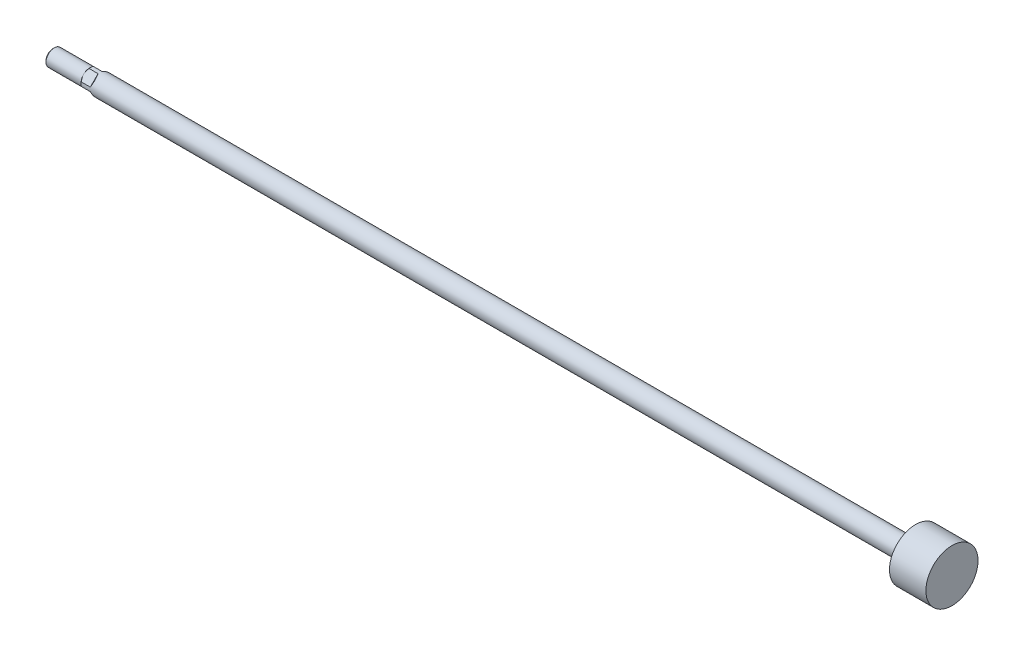
ISO-10303-21;
HEADER;
FILE_DESCRIPTION(('STEP AP214'),'2;1');
FILE_NAME('part.step','',(''),(''),'','','');
FILE_SCHEMA(('AUTOMOTIVE_DESIGN { 1 0 10303 214 1 1 1 1 }'));
ENDSEC;
DATA;
#1=APPLICATION_CONTEXT('core data for automotive mechanical design processes');
#2=APPLICATION_PROTOCOL_DEFINITION('international standard','automotive_design',2000,#1);
#3=PRODUCT_CONTEXT('',#1,'mechanical');
#4=PRODUCT('Part','Part','',(#3));
#5=PRODUCT_RELATED_PRODUCT_CATEGORY('part','',(#4));
#6=PRODUCT_DEFINITION_FORMATION('','',#4);
#7=PRODUCT_DEFINITION_CONTEXT('part definition',#1,'design');
#8=PRODUCT_DEFINITION('design','',#6,#7);
#9=PRODUCT_DEFINITION_SHAPE('','',#8);
#10=(LENGTH_UNIT() NAMED_UNIT(*) SI_UNIT(.MILLI.,.METRE.));
#11=(NAMED_UNIT(*) PLANE_ANGLE_UNIT() SI_UNIT($,.RADIAN.));
#12=(NAMED_UNIT(*) SI_UNIT($,.STERADIAN.) SOLID_ANGLE_UNIT());
#13=UNCERTAINTY_MEASURE_WITH_UNIT(LENGTH_MEASURE(1.E-05),#10,'distance_accuracy_value','');
#14=(GEOMETRIC_REPRESENTATION_CONTEXT(3) GLOBAL_UNCERTAINTY_ASSIGNED_CONTEXT((#13)) GLOBAL_UNIT_ASSIGNED_CONTEXT((#10,
#11,#12)) REPRESENTATION_CONTEXT('',''));
#15=CARTESIAN_POINT('',(0.,0.,0.));
#16=DIRECTION('',(0.,0.,1.));
#17=DIRECTION('',(1.,0.,0.));
#18=AXIS2_PLACEMENT_3D('',#15,#16,#17);
#19=CARTESIAN_POINT('',(23.,0.,0.));
#20=DIRECTION('',(1.,0.,0.));
#21=DIRECTION('',(0.,0.,-1.));
#22=AXIS2_PLACEMENT_3D('',#19,#20,#21);
#23=CONICAL_SURFACE('',#22,5.99999999999999,0.785398163397445);
#24=CARTESIAN_POINT('',(23.,0.,0.));
#25=DIRECTION('',(-1.,0.,0.));
#26=DIRECTION('',(0.,0.,1.));
#27=AXIS2_PLACEMENT_3D('',#24,#25,#26);
#28=CIRCLE('',#27,5.99999999999999);
#29=CARTESIAN_POINT('',(23.,-5.88074178584445,-1.19032602602103));
#30=VERTEX_POINT('',#29);
#31=CARTESIAN_POINT('',(23.,-5.88074178584444,1.19032602602103));
#32=VERTEX_POINT('',#31);
#33=EDGE_CURVE('E207',#30,#32,#28,.T.);
#34=ORIENTED_EDGE('',*,*,#33,.T.);
#35=CARTESIAN_POINT('',(23.0002,-5.88099761701418,1.19007019485129));
#36=CARTESIAN_POINT('',(22.9510440724068,-5.81811483877079,1.25295297309469));
#37=CARTESIAN_POINT('',(22.9029313524006,-5.75482507418754,1.31624273767794));
#38=CARTESIAN_POINT('',(22.8090823894487,-5.62734850641512,1.44371930545035));
#39=CARTESIAN_POINT('',(22.7633468355185,-5.56316144991378,1.5079063619517));
#40=CARTESIAN_POINT('',(22.6298425181199,-5.36868839423572,1.70237941762975));
#41=CARTESIAN_POINT('',(22.5461580251507,-5.23697199461113,1.83409581725435));
#42=CARTESIAN_POINT('',(22.3921031533509,-4.96822727016499,2.10284054170049));
#43=CARTESIAN_POINT('',(22.3218635701848,-4.83116098734405,2.23990682452143));
#44=CARTESIAN_POINT('',(22.1996463430325,-4.55314819356125,2.51791961830423));
#45=CARTESIAN_POINT('',(22.1476398226633,-4.41220820286018,2.6588596090053));
#46=CARTESIAN_POINT('',(22.076734746217,-4.16562053549287,2.9054472763726));
#47=CARTESIAN_POINT('',(22.0526890191447,-4.06071275132046,3.01035506054501));
#48=CARTESIAN_POINT('',(22.0175298585743,-3.84979184907856,3.22127596278691));
#49=CARTESIAN_POINT('',(22.0064169654416,-3.7437786850103,3.32728912685517));
#50=CARTESIAN_POINT('',(21.9977783521526,-3.53213647013354,3.53893134173194));
#51=CARTESIAN_POINT('',(22.0001680259723,-3.42650916818231,3.64455864368317));
#52=CARTESIAN_POINT('',(22.0181960610271,-3.21582855252734,3.85523925933814));
#53=CARTESIAN_POINT('',(22.0338352417217,-3.1107752747305,3.96029253713497));
#54=CARTESIAN_POINT('',(22.0830231598923,-2.87582236565578,4.19524544620969));
#55=CARTESIAN_POINT('',(22.1200764012196,-2.74628952530572,4.32477828655975));
#56=CARTESIAN_POINT('',(22.2110065453868,-2.49021090718481,4.58085690468066));
#57=CARTESIAN_POINT('',(22.2648923193015,-2.36366674241764,4.70740106944784));
#58=CARTESIAN_POINT('',(22.386785732996,-2.11334572452889,4.95772208733659));
#59=CARTESIAN_POINT('',(22.4548649705229,-1.989586569211,5.08148124265448));
#60=CARTESIAN_POINT('',(22.6021483972448,-1.74549978196564,5.32556802989984));
#61=CARTESIAN_POINT('',(22.6813495208955,-1.62517121541694,5.44589659644854));
#62=CARTESIAN_POINT('',(22.8025857634105,-1.45295236100189,5.61811545086358));
#63=CARTESIAN_POINT('',(22.8411147424624,-1.39980646766215,5.67126134420333));
#64=CARTESIAN_POINT('',(22.9195954983845,-1.29437286498691,5.77669494687857));
#65=CARTESIAN_POINT('',(22.9595394195067,-1.24208223430455,5.82898557756093));
#66=CARTESIAN_POINT('',(23.0002,-1.19007019485129,5.88099761701419));
#67=B_SPLINE_CURVE_WITH_KNOTS('',3,(#35,#36,#37,#38,#39,#40,#41,#42,#43,#44,#45,#46,#47,#48,#49,
#50,#51,#52,#53,#54,#55,#56,#57,#58,#59,#60,#61,#62,#63,#64,#65,#66),.UNSPECIFIED.,.F.,.F.,(4,2,
2,2,2,2,2,2,2,2,2,2,2,2,2,4),(0.,0.304819578685165,0.609727021411994,1.22188083188482,
1.83971682595719,2.45656986235395,2.90695888785131,3.35736673103194,3.80495549641761,
4.2525719464311,4.81229509723279,5.37231373221707,5.93522881986322,6.49798905371364,
6.75135396448927,7.00348316582242),.UNSPECIFIED.);
#68=CARTESIAN_POINT('',(22.,-3.53553390593274,3.53553390593274));
#69=VERTEX_POINT('',#68);
#70=EDGE_CURVE('E245',#32,#69,#67,.T.);
#71=ORIENTED_EDGE('',*,*,#70,.T.);
#72=CARTESIAN_POINT('',(22.,0.,0.));
#73=DIRECTION('',(-1.,0.,0.));
#74=DIRECTION('',(0.,0.,1.));
#75=AXIS2_PLACEMENT_3D('',#72,#73,#74);
#76=CIRCLE('',#75,5.);
#77=CARTESIAN_POINT('',(22.,-3.53553390593274,-3.53553390593274));
#78=VERTEX_POINT('',#77);
#79=EDGE_CURVE('E216',#78,#69,#76,.T.);
#80=ORIENTED_EDGE('',*,*,#79,.F.);
#81=CARTESIAN_POINT('',(23.0002,-1.19007019485129,-5.88099761701418));
#82=CARTESIAN_POINT('',(22.9510440724068,-1.25295297309469,-5.81811483877079));
#83=CARTESIAN_POINT('',(22.9029313524006,-1.31624273767794,-5.75482507418754));
#84=CARTESIAN_POINT('',(22.8090823894487,-1.44371930545035,-5.62734850641512));
#85=CARTESIAN_POINT('',(22.7633468355185,-1.50790636195169,-5.56316144991378));
#86=CARTESIAN_POINT('',(22.6298425181199,-1.70237941762975,-5.36868839423572));
#87=CARTESIAN_POINT('',(22.5461580251507,-1.83409581725435,-5.23697199461113));
#88=CARTESIAN_POINT('',(22.3921031533509,-2.10284054170049,-4.96822727016499));
#89=CARTESIAN_POINT('',(22.3218635701848,-2.23990682452143,-4.83116098734405));
#90=CARTESIAN_POINT('',(22.1996463430325,-2.51791961830422,-4.55314819356125));
#91=CARTESIAN_POINT('',(22.1476398226633,-2.6588596090053,-4.41220820286018));
#92=CARTESIAN_POINT('',(22.076734746217,-2.9054472763726,-4.16562053549287));
#93=CARTESIAN_POINT('',(22.0526890191447,-3.01035506054501,-4.06071275132046));
#94=CARTESIAN_POINT('',(22.0175298585743,-3.22127596278691,-3.84979184907856));
#95=CARTESIAN_POINT('',(22.0064169654416,-3.32728912685517,-3.7437786850103));
#96=CARTESIAN_POINT('',(21.9977783521526,-3.53893134173194,-3.53213647013354));
#97=CARTESIAN_POINT('',(22.0001680259723,-3.64455864368317,-3.42650916818231));
#98=CARTESIAN_POINT('',(22.0181960610271,-3.85523925933814,-3.21582855252734));
#99=CARTESIAN_POINT('',(22.0338352417217,-3.96029253713497,-3.1107752747305));
#100=CARTESIAN_POINT('',(22.0830231598923,-4.19524544620969,-2.87582236565578));
#101=CARTESIAN_POINT('',(22.1200764012196,-4.32477828655975,-2.74628952530572));
#102=CARTESIAN_POINT('',(22.2110065453868,-4.58085690468066,-2.49021090718481));
#103=CARTESIAN_POINT('',(22.2648923193015,-4.70740106944784,-2.36366674241764));
#104=CARTESIAN_POINT('',(22.386785732996,-4.95772208733659,-2.11334572452889));
#105=CARTESIAN_POINT('',(22.4548649705229,-5.08148124265448,-1.989586569211));
#106=CARTESIAN_POINT('',(22.6021483972448,-5.32556802989984,-1.74549978196564));
#107=CARTESIAN_POINT('',(22.6813495208955,-5.44589659644854,-1.62517121541694));
#108=CARTESIAN_POINT('',(22.8025857634105,-5.61811545086358,-1.45295236100189));
#109=CARTESIAN_POINT('',(22.8411147424624,-5.67126134420333,-1.39980646766215));
#110=CARTESIAN_POINT('',(22.9195954983845,-5.77669494687857,-1.29437286498691));
#111=CARTESIAN_POINT('',(22.9595394195067,-5.82898557756092,-1.24208223430455));
#112=CARTESIAN_POINT('',(23.0002,-5.88099761701419,-1.19007019485129));
#113=B_SPLINE_CURVE_WITH_KNOTS('',3,(#81,#82,#83,#84,#85,#86,#87,#88,#89,#90,#91,#92,#93,#94,
#95,#96,#97,#98,#99,#100,#101,#102,#103,#104,#105,#106,#107,#108,#109,#110,#111,#112),
.UNSPECIFIED.,.F.,.F.,(4,2,2,2,2,2,2,2,2,2,2,2,2,2,2,4),(0.,0.304819578685165,0.609727021411994,
1.22188083188482,1.83971682595719,2.45656986235395,2.90695888785131,3.35736673103194,
3.80495549641761,4.2525719464311,4.81229509723279,5.37231373221707,5.93522881986322,
6.49798905371364,6.75135396448927,7.00348316582242),.UNSPECIFIED.);
#114=EDGE_CURVE('E192',#78,#30,#113,.T.);
#115=ORIENTED_EDGE('',*,*,#114,.T.);
#116=EDGE_LOOP('',(#34,#71,#80,#115));
#117=FACE_BOUND('',#116,.T.);
#118=ADVANCED_FACE('F37',(#117),#23,.T.);
#119=CARTESIAN_POINT('',(23.,5.88074178584445,1.19032602602103));
#120=VERTEX_POINT('',#119);
#121=CARTESIAN_POINT('',(23.,5.88074178584444,-1.19032602602103));
#122=VERTEX_POINT('',#121);
#123=EDGE_CURVE('E209',#120,#122,#28,.T.);
#124=ORIENTED_EDGE('',*,*,#123,.T.);
#125=CARTESIAN_POINT('',(23.0002,5.88099761701418,-1.19007019485129));
#126=CARTESIAN_POINT('',(22.9510440724068,5.81811483877079,-1.25295297309469));
#127=CARTESIAN_POINT('',(22.9029313524006,5.75482507418754,-1.31624273767794));
#128=CARTESIAN_POINT('',(22.8090823894487,5.62734850641512,-1.44371930545035));
#129=CARTESIAN_POINT('',(22.7633468355185,5.56316144991378,-1.5079063619517));
#130=CARTESIAN_POINT('',(22.6298425181199,5.36868839423572,-1.70237941762975));
#131=CARTESIAN_POINT('',(22.5461580251507,5.23697199461113,-1.83409581725435));
#132=CARTESIAN_POINT('',(22.3921031533509,4.96822727016499,-2.10284054170049));
#133=CARTESIAN_POINT('',(22.3218635701848,4.83116098734405,-2.23990682452143));
#134=CARTESIAN_POINT('',(22.1996463430325,4.55314819356125,-2.51791961830423));
#135=CARTESIAN_POINT('',(22.1476398226633,4.41220820286018,-2.6588596090053));
#136=CARTESIAN_POINT('',(22.076734746217,4.16562053549287,-2.9054472763726));
#137=CARTESIAN_POINT('',(22.0526890191447,4.06071275132046,-3.01035506054501));
#138=CARTESIAN_POINT('',(22.0175298585743,3.84979184907856,-3.22127596278691));
#139=CARTESIAN_POINT('',(22.0064169654416,3.7437786850103,-3.32728912685517));
#140=CARTESIAN_POINT('',(21.9977783521526,3.53213647013354,-3.53893134173194));
#141=CARTESIAN_POINT('',(22.0001680259723,3.42650916818231,-3.64455864368317));
#142=CARTESIAN_POINT('',(22.0181960610271,3.21582855252734,-3.85523925933813));
#143=CARTESIAN_POINT('',(22.0338352417217,3.1107752747305,-3.96029253713497));
#144=CARTESIAN_POINT('',(22.0830231598923,2.87582236565578,-4.19524544620969));
#145=CARTESIAN_POINT('',(22.1200764012196,2.74628952530573,-4.32477828655975));
#146=CARTESIAN_POINT('',(22.2110065453868,2.49021090718481,-4.58085690468066));
#147=CARTESIAN_POINT('',(22.2648923193015,2.36366674241764,-4.70740106944784));
#148=CARTESIAN_POINT('',(22.386785732996,2.11334572452889,-4.95772208733659));
#149=CARTESIAN_POINT('',(22.4548649705229,1.989586569211,-5.08148124265448));
#150=CARTESIAN_POINT('',(22.6021483972448,1.74549978196564,-5.32556802989984));
#151=CARTESIAN_POINT('',(22.6813495208955,1.62517121541694,-5.44589659644854));
#152=CARTESIAN_POINT('',(22.8025857634105,1.4529523610019,-5.61811545086358));
#153=CARTESIAN_POINT('',(22.8411147424624,1.39980646766215,-5.67126134420333));
#154=CARTESIAN_POINT('',(22.9195954983845,1.29437286498691,-5.77669494687856));
#155=CARTESIAN_POINT('',(22.9595394195067,1.24208223430455,-5.82898557756092));
#156=CARTESIAN_POINT('',(23.0002,1.19007019485129,-5.88099761701419));
#157=B_SPLINE_CURVE_WITH_KNOTS('',3,(#125,#126,#127,#128,#129,#130,#131,#132,#133,#134,#135,
#136,#137,#138,#139,#140,#141,#142,#143,#144,#145,#146,#147,#148,#149,#150,#151,#152,#153,#154,
#155,#156),.UNSPECIFIED.,.F.,.F.,(4,2,2,2,2,2,2,2,2,2,2,2,2,2,2,4),(0.,0.304819578685164,
0.609727021411993,1.22188083188482,1.83971682595719,2.45656986235395,2.9069588878513,
3.35736673103194,3.80495549641761,4.2525719464311,4.81229509723279,5.37231373221707,
5.93522881986322,6.49798905371364,6.75135396448926,7.00348316582241),.UNSPECIFIED.);
#158=CARTESIAN_POINT('',(22.,3.53553390593274,-3.53553390593274));
#159=VERTEX_POINT('',#158);
#160=EDGE_CURVE('E144',#122,#159,#157,.T.);
#161=ORIENTED_EDGE('',*,*,#160,.T.);
#162=CARTESIAN_POINT('',(22.,3.53553390593274,3.53553390593274));
#163=VERTEX_POINT('',#162);
#164=EDGE_CURVE('E210',#163,#159,#76,.T.);
#165=ORIENTED_EDGE('',*,*,#164,.F.);
#166=CARTESIAN_POINT('',(23.0002,1.19007019485129,5.88099761701418));
#167=CARTESIAN_POINT('',(22.9510440724068,1.25295297309469,5.81811483877079));
#168=CARTESIAN_POINT('',(22.9029313524006,1.31624273767794,5.75482507418753));
#169=CARTESIAN_POINT('',(22.8090823894487,1.44371930545035,5.62734850641512));
#170=CARTESIAN_POINT('',(22.7633468355185,1.5079063619517,5.56316144991378));
#171=CARTESIAN_POINT('',(22.6298425181199,1.70237941762975,5.36868839423572));
#172=CARTESIAN_POINT('',(22.5461580251507,1.83409581725435,5.23697199461112));
#173=CARTESIAN_POINT('',(22.3921031533509,2.10284054170049,4.96822727016498));
#174=CARTESIAN_POINT('',(22.3218635701848,2.23990682452143,4.83116098734405));
#175=CARTESIAN_POINT('',(22.1996463430325,2.51791961830423,4.55314819356125));
#176=CARTESIAN_POINT('',(22.1476398226633,2.6588596090053,4.41220820286018));
#177=CARTESIAN_POINT('',(22.076734746217,2.90544727637261,4.16562053549287));
#178=CARTESIAN_POINT('',(22.0526890191447,3.01035506054502,4.06071275132046));
#179=CARTESIAN_POINT('',(22.0175298585743,3.22127596278691,3.84979184907856));
#180=CARTESIAN_POINT('',(22.0064169654416,3.32728912685517,3.7437786850103));
#181=CARTESIAN_POINT('',(21.9977783521526,3.53893134173194,3.53213647013354));
#182=CARTESIAN_POINT('',(22.0001680259723,3.64455864368317,3.42650916818231));
#183=CARTESIAN_POINT('',(22.0181960610271,3.85523925933814,3.21582855252734));
#184=CARTESIAN_POINT('',(22.0338352417217,3.96029253713497,3.1107752747305));
#185=CARTESIAN_POINT('',(22.0830231598923,4.1952454462097,2.87582236565578));
#186=CARTESIAN_POINT('',(22.1200764012196,4.32477828655975,2.74628952530572));
#187=CARTESIAN_POINT('',(22.2110065453868,4.58085690468066,2.49021090718481));
#188=CARTESIAN_POINT('',(22.2648923193015,4.70740106944784,2.36366674241764));
#189=CARTESIAN_POINT('',(22.386785732996,4.95772208733659,2.11334572452888));
#190=CARTESIAN_POINT('',(22.4548649705229,5.08148124265448,1.989586569211));
#191=CARTESIAN_POINT('',(22.6021483972448,5.32556802989984,1.74549978196563));
#192=CARTESIAN_POINT('',(22.6813495208955,5.44589659644854,1.62517121541693));
#193=CARTESIAN_POINT('',(22.8025857634105,5.61811545086359,1.45295236100189));
#194=CARTESIAN_POINT('',(22.8411147424624,5.67126134420333,1.39980646766215));
#195=CARTESIAN_POINT('',(22.9195954983845,5.77669494687857,1.29437286498691));
#196=CARTESIAN_POINT('',(22.9595394195067,5.82898557756092,1.24208223430455));
#197=CARTESIAN_POINT('',(23.0002,5.88099761701419,1.19007019485129));
#198=B_SPLINE_CURVE_WITH_KNOTS('',3,(#166,#167,#168,#169,#170,#171,#172,#173,#174,#175,#176,
#177,#178,#179,#180,#181,#182,#183,#184,#185,#186,#187,#188,#189,#190,#191,#192,#193,#194,#195,
#196,#197),.UNSPECIFIED.,.F.,.F.,(4,2,2,2,2,2,2,2,2,2,2,2,2,2,2,4),(0.,0.304819578685165,
0.609727021411994,1.22188083188483,1.83971682595719,2.45656986235395,2.90695888785131,
3.35736673103194,3.80495549641761,4.2525719464311,4.81229509723279,5.37231373221707,
5.93522881986323,6.49798905371364,6.75135396448926,7.00348316582241),.UNSPECIFIED.);
#199=EDGE_CURVE('E183',#163,#120,#198,.T.);
#200=ORIENTED_EDGE('',*,*,#199,.T.);
#201=EDGE_LOOP('',(#124,#161,#165,#200));
#202=FACE_BOUND('',#201,.T.);
#203=ADVANCED_FACE('F259',(#202),#23,.T.);
#204=EDGE_CURVE('E215',#69,#163,#76,.T.);
#205=ORIENTED_EDGE('',*,*,#204,.F.);
#206=CARTESIAN_POINT('',(23.,-1.19032602602103,5.88074178584445));
#207=VERTEX_POINT('',#206);
#208=EDGE_CURVE('E152',#69,#207,#67,.T.);
#209=ORIENTED_EDGE('',*,*,#208,.T.);
#210=CARTESIAN_POINT('',(23.,1.19032602602103,5.88074178584444));
#211=VERTEX_POINT('',#210);
#212=EDGE_CURVE('E206',#207,#211,#28,.T.);
#213=ORIENTED_EDGE('',*,*,#212,.T.);
#214=EDGE_CURVE('E190',#211,#163,#198,.T.);
#215=ORIENTED_EDGE('',*,*,#214,.T.);
#216=EDGE_LOOP('',(#205,#209,#213,#215));
#217=FACE_BOUND('',#216,.T.);
#218=ADVANCED_FACE('F268',(#217),#23,.T.);
#219=CARTESIAN_POINT('',(0.,0.,0.));
#220=DIRECTION('',(1.,0.,0.));
#221=DIRECTION('',(0.,0.,-1.));
#222=AXIS2_PLACEMENT_3D('',#219,#220,#221);
#223=PLANE('',#222);
#224=CARTESIAN_POINT('',(0.,0.,0.));
#225=DIRECTION('',(-1.,0.,0.));
#226=DIRECTION('',(0.,0.,1.));
#227=AXIS2_PLACEMENT_3D('',#224,#225,#226);
#228=CIRCLE('',#227,4.233);
#229=CARTESIAN_POINT('',(0.,0.,4.233));
#230=VERTEX_POINT('',#229);
#231=EDGE_CURVE('E219',#230,#230,#228,.T.);
#232=ORIENTED_EDGE('',*,*,#231,.T.);
#233=EDGE_LOOP('',(#232));
#234=FACE_BOUND('',#233,.T.);
#235=ADVANCED_FACE('F39',(#234),#223,.F.);
#236=CARTESIAN_POINT('',(0.766999999999962,0.,0.));
#237=DIRECTION('',(1.,0.,0.));
#238=DIRECTION('',(0.,0.,-1.));
#239=AXIS2_PLACEMENT_3D('',#236,#237,#238);
#240=CONICAL_SURFACE('',#239,5.,0.785398163397473);
#241=ORIENTED_EDGE('',*,*,#231,.F.);
#242=EDGE_LOOP('',(#241));
#243=FACE_BOUND('',#242,.T.);
#244=CARTESIAN_POINT('',(0.766999999999962,0.,0.));
#245=DIRECTION('',(-1.,0.,0.));
#246=DIRECTION('',(0.,0.,1.));
#247=AXIS2_PLACEMENT_3D('',#244,#245,#246);
#248=CIRCLE('',#247,5.);
#249=CARTESIAN_POINT('',(0.766999999999962,0.,5.));
#250=VERTEX_POINT('',#249);
#251=EDGE_CURVE('E213',#250,#250,#248,.T.);
#252=ORIENTED_EDGE('',*,*,#251,.T.);
#253=EDGE_LOOP('',(#252));
#254=FACE_BOUND('',#253,.T.);
#255=ADVANCED_FACE('F290',(#243,#254),#240,.T.);
#256=CARTESIAN_POINT('',(543.,0.,0.));
#257=DIRECTION('',(-1.,0.,0.));
#258=DIRECTION('',(0.,0.,1.));
#259=AXIS2_PLACEMENT_3D('',#256,#257,#258);
#260=CYLINDRICAL_SURFACE('',#259,5.);
#261=ORIENTED_EDGE('',*,*,#251,.F.);
#262=EDGE_LOOP('',(#261));
#263=FACE_BOUND('',#262,.T.);
#264=ORIENTED_EDGE('',*,*,#164,.T.);
#265=EDGE_CURVE('E214',#159,#78,#76,.T.);
#266=ORIENTED_EDGE('',*,*,#265,.T.);
#267=ORIENTED_EDGE('',*,*,#79,.T.);
#268=ORIENTED_EDGE('',*,*,#204,.T.);
#269=EDGE_LOOP('',(#264,#266,#267,#268));
#270=FACE_BOUND('',#269,.T.);
#271=ADVANCED_FACE('F267',(#263,#270),#260,.T.);
#272=ORIENTED_EDGE('',*,*,#265,.F.);
#273=CARTESIAN_POINT('',(23.,1.19032602602103,-5.88074178584445));
#274=VERTEX_POINT('',#273);
#275=EDGE_CURVE('E142',#159,#274,#157,.T.);
#276=ORIENTED_EDGE('',*,*,#275,.T.);
#277=CARTESIAN_POINT('',(23.,-1.19032602602103,-5.88074178584444));
#278=VERTEX_POINT('',#277);
#279=EDGE_CURVE('E130',#274,#278,#28,.T.);
#280=ORIENTED_EDGE('',*,*,#279,.T.);
#281=EDGE_CURVE('E191',#278,#78,#113,.T.);
#282=ORIENTED_EDGE('',*,*,#281,.T.);
#283=EDGE_LOOP('',(#272,#276,#280,#282));
#284=FACE_BOUND('',#283,.T.);
#285=ADVANCED_FACE('F158',(#284),#23,.T.);
#286=CARTESIAN_POINT('',(543.,0.,0.));
#287=DIRECTION('',(-1.,0.,0.));
#288=DIRECTION('',(0.,0.,1.));
#289=AXIS2_PLACEMENT_3D('',#286,#287,#288);
#290=CYLINDRICAL_SURFACE('',#289,6.);
#291=CARTESIAN_POINT('',(23.4,0.,0.));
#292=DIRECTION('',(0.707106781186547,0.5,-0.5));
#293=DIRECTION('',(-0.707106781186548,0.5,-0.5));
#294=AXIS2_PLACEMENT_3D('',#291,#292,#293);
#295=ELLIPSE('',#294,8.48528137423857,6.);
#296=CARTESIAN_POINT('',(28.4,-1.19032602602103,5.88074178584445));
#297=VERTEX_POINT('',#296);
#298=CARTESIAN_POINT('',(28.4,-5.88074178584445,1.19032602602103));
#299=VERTEX_POINT('',#298);
#300=EDGE_CURVE('E45',#297,#299,#295,.T.);
#301=ORIENTED_EDGE('',*,*,#300,.T.);
#302=DIRECTION('',(-1.,0.,0.));
#303=VECTOR('',#302,1.);
#304=CARTESIAN_POINT('',(543.,-5.88074178584445,1.19032602602103));
#305=LINE('',#304,#303);
#306=EDGE_CURVE('E11',#299,#32,#305,.T.);
#307=ORIENTED_EDGE('',*,*,#306,.T.);
#308=ORIENTED_EDGE('',*,*,#33,.F.);
#309=DIRECTION('',(-1.,0.,0.));
#310=VECTOR('',#309,1.);
#311=CARTESIAN_POINT('',(543.,-5.88074178584445,-1.19032602602103));
#312=LINE('',#311,#310);
#313=CARTESIAN_POINT('',(28.4,-5.8807417858445,-1.19032602602098));
#314=VERTEX_POINT('',#313);
#315=EDGE_CURVE('E225',#30,#314,#312,.F.);
#316=ORIENTED_EDGE('',*,*,#315,.T.);
#317=CARTESIAN_POINT('',(23.4000000000001,0.,0.));
#318=DIRECTION('',(0.707106781186547,0.5,0.5));
#319=DIRECTION('',(-0.707106781186548,0.5,0.5));
#320=AXIS2_PLACEMENT_3D('',#317,#318,#319);
#321=ELLIPSE('',#320,8.48528137423857,6.);
#322=CARTESIAN_POINT('',(28.4,-1.19032602602098,-5.88074178584449));
#323=VERTEX_POINT('',#322);
#324=EDGE_CURVE('E222',#314,#323,#321,.T.);
#325=ORIENTED_EDGE('',*,*,#324,.T.);
#326=DIRECTION('',(-1.,0.,0.));
#327=VECTOR('',#326,1.);
#328=CARTESIAN_POINT('',(543.,-1.19032602602103,-5.88074178584445));
#329=LINE('',#328,#327);
#330=EDGE_CURVE('E228',#323,#278,#329,.T.);
#331=ORIENTED_EDGE('',*,*,#330,.T.);
#332=ORIENTED_EDGE('',*,*,#279,.F.);
#333=DIRECTION('',(-1.,0.,0.));
#334=VECTOR('',#333,1.);
#335=CARTESIAN_POINT('',(543.,1.19032602602103,-5.88074178584445));
#336=LINE('',#335,#334);
#337=CARTESIAN_POINT('',(28.4,1.19032602602098,-5.8807417858445));
#338=VERTEX_POINT('',#337);
#339=EDGE_CURVE('E117',#274,#338,#336,.F.);
#340=ORIENTED_EDGE('',*,*,#339,.T.);
#341=CARTESIAN_POINT('',(23.4000000000001,0.,0.));
#342=DIRECTION('',(0.707106781186547,-0.5,0.5));
#343=DIRECTION('',(-0.707106781186548,-0.5,0.5));
#344=AXIS2_PLACEMENT_3D('',#341,#342,#343);
#345=ELLIPSE('',#344,8.48528137423857,6.);
#346=CARTESIAN_POINT('',(28.4,5.8807417858445,-1.19032602602098));
#347=VERTEX_POINT('',#346);
#348=EDGE_CURVE('E112',#338,#347,#345,.T.);
#349=ORIENTED_EDGE('',*,*,#348,.T.);
#350=DIRECTION('',(-1.,0.,0.));
#351=VECTOR('',#350,1.);
#352=CARTESIAN_POINT('',(543.,5.88074178584445,-1.19032602602103));
#353=LINE('',#352,#351);
#354=EDGE_CURVE('E123',#347,#122,#353,.T.);
#355=ORIENTED_EDGE('',*,*,#354,.T.);
#356=ORIENTED_EDGE('',*,*,#123,.F.);
#357=DIRECTION('',(-1.,0.,0.));
#358=VECTOR('',#357,1.);
#359=CARTESIAN_POINT('',(543.,5.88074178584445,1.19032602602103));
#360=LINE('',#359,#358);
#361=CARTESIAN_POINT('',(28.4,5.88074178584445,1.19032602602103));
#362=VERTEX_POINT('',#361);
#363=EDGE_CURVE('E230',#120,#362,#360,.F.);
#364=ORIENTED_EDGE('',*,*,#363,.T.);
#365=CARTESIAN_POINT('',(23.4,0.,0.));
#366=DIRECTION('',(0.707106781186547,-0.5,-0.5));
#367=DIRECTION('',(-0.707106781186548,-0.5,-0.5));
#368=AXIS2_PLACEMENT_3D('',#365,#366,#367);
#369=ELLIPSE('',#368,8.48528137423857,6.);
#370=CARTESIAN_POINT('',(28.4,1.19032602602103,5.88074178584445));
#371=VERTEX_POINT('',#370);
#372=EDGE_CURVE('E233',#362,#371,#369,.T.);
#373=ORIENTED_EDGE('',*,*,#372,.T.);
#374=DIRECTION('',(-1.,0.,0.));
#375=VECTOR('',#374,1.);
#376=CARTESIAN_POINT('',(543.,1.19032602602103,5.88074178584445));
#377=LINE('',#376,#375);
#378=EDGE_CURVE('E118',#371,#211,#377,.T.);
#379=ORIENTED_EDGE('',*,*,#378,.T.);
#380=ORIENTED_EDGE('',*,*,#212,.F.);
#381=DIRECTION('',(-1.,0.,0.));
#382=VECTOR('',#381,1.);
#383=CARTESIAN_POINT('',(543.,-1.19032602602103,5.88074178584445));
#384=LINE('',#383,#382);
#385=EDGE_CURVE('E132',#207,#297,#384,.F.);
#386=ORIENTED_EDGE('',*,*,#385,.T.);
#387=EDGE_LOOP('',(#301,#307,#308,#316,#325,#331,#332,#340,#349,#355,#356,#364,#373,#379,#380,#386));
#388=FACE_BOUND('',#387,.T.);
#389=CARTESIAN_POINT('',(521.,0.,0.));
#390=DIRECTION('',(-1.,0.,0.));
#391=DIRECTION('',(0.,0.,1.));
#392=AXIS2_PLACEMENT_3D('',#389,#390,#391);
#393=CIRCLE('',#392,6.);
#394=CARTESIAN_POINT('',(521.,0.,6.));
#395=VERTEX_POINT('',#394);
#396=EDGE_CURVE('E203',#395,#395,#393,.T.);
#397=ORIENTED_EDGE('',*,*,#396,.T.);
#398=EDGE_LOOP('',(#397));
#399=FACE_BOUND('',#398,.T.);
#400=ADVANCED_FACE('F127',(#388,#399),#290,.T.);
#401=CARTESIAN_POINT('',(521.,6.,0.));
#402=DIRECTION('',(1.,0.,0.));
#403=DIRECTION('',(0.,0.,-1.));
#404=AXIS2_PLACEMENT_3D('',#401,#402,#403);
#405=PLANE('',#404);
#406=ORIENTED_EDGE('',*,*,#396,.F.);
#407=EDGE_LOOP('',(#406));
#408=FACE_BOUND('',#407,.T.);
#409=CARTESIAN_POINT('',(521.,0.,0.));
#410=DIRECTION('',(-1.,0.,0.));
#411=DIRECTION('',(0.,0.,1.));
#412=AXIS2_PLACEMENT_3D('',#409,#410,#411);
#413=CIRCLE('',#412,15.75);
#414=CARTESIAN_POINT('',(521.,0.,15.75));
#415=VERTEX_POINT('',#414);
#416=EDGE_CURVE('E200',#415,#415,#413,.T.);
#417=ORIENTED_EDGE('',*,*,#416,.T.);
#418=EDGE_LOOP('',(#417));
#419=FACE_BOUND('',#418,.T.);
#420=ADVANCED_FACE('F289',(#408,#419),#405,.F.);
#421=CARTESIAN_POINT('',(543.,0.,0.));
#422=DIRECTION('',(-1.,0.,0.));
#423=DIRECTION('',(0.,0.,1.));
#424=AXIS2_PLACEMENT_3D('',#421,#422,#423);
#425=CYLINDRICAL_SURFACE('',#424,15.75);
#426=ORIENTED_EDGE('',*,*,#416,.F.);
#427=EDGE_LOOP('',(#426));
#428=FACE_BOUND('',#427,.T.);
#429=CARTESIAN_POINT('',(543.,0.,0.));
#430=DIRECTION('',(-1.,0.,0.));
#431=DIRECTION('',(0.,0.,1.));
#432=AXIS2_PLACEMENT_3D('',#429,#430,#431);
#433=CIRCLE('',#432,15.75);
#434=CARTESIAN_POINT('',(543.,0.,15.75));
#435=VERTEX_POINT('',#434);
#436=EDGE_CURVE('E197',#435,#435,#433,.T.);
#437=ORIENTED_EDGE('',*,*,#436,.T.);
#438=EDGE_LOOP('',(#437));
#439=FACE_BOUND('',#438,.T.);
#440=ADVANCED_FACE('F277',(#428,#439),#425,.T.);
#441=CARTESIAN_POINT('',(543.,15.75,0.));
#442=DIRECTION('',(-1.,0.,0.));
#443=DIRECTION('',(0.,0.,1.));
#444=AXIS2_PLACEMENT_3D('',#441,#442,#443);
#445=PLANE('',#444);
#446=ORIENTED_EDGE('',*,*,#436,.F.);
#447=EDGE_LOOP('',(#446));
#448=FACE_BOUND('',#447,.T.);
#449=ADVANCED_FACE('F272',(#448),#445,.F.);
#450=CARTESIAN_POINT('',(35.4,-4.94974746830583,-12.0208152801713));
#451=DIRECTION('',(0.707106781186547,0.5,0.5));
#452=DIRECTION('',(0.577350269189626,0.,-0.816496580927726));
#453=AXIS2_PLACEMENT_3D('',#450,#451,#452);
#454=PLANE('',#453);
#455=DIRECTION('',(0.,-0.707106781186548,0.707106781186547));
#456=VECTOR('',#455,1.);
#457=CARTESIAN_POINT('',(28.4,0.,-7.07106781186548));
#458=LINE('',#457,#456);
#459=EDGE_CURVE('E242',#323,#314,#458,.T.);
#460=ORIENTED_EDGE('',*,*,#459,.F.);
#461=ORIENTED_EDGE('',*,*,#324,.F.);
#462=EDGE_LOOP('',(#460,#461));
#463=FACE_BOUND('',#462,.T.);
#464=ADVANCED_FACE('F270',(#463),#454,.F.);
#465=CARTESIAN_POINT('',(28.4,0.,-7.07106781186548));
#466=DIRECTION('',(0.,0.707106781186547,0.707106781186548));
#467=DIRECTION('',(0.,-0.707106781186548,0.707106781186547));
#468=AXIS2_PLACEMENT_3D('',#465,#466,#467);
#469=PLANE('',#468);
#470=ORIENTED_EDGE('',*,*,#459,.T.);
#471=ORIENTED_EDGE('',*,*,#315,.F.);
#472=ORIENTED_EDGE('',*,*,#114,.F.);
#473=ORIENTED_EDGE('',*,*,#281,.F.);
#474=ORIENTED_EDGE('',*,*,#330,.F.);
#475=EDGE_LOOP('',(#470,#471,#472,#473,#474));
#476=FACE_BOUND('',#475,.T.);
#477=ADVANCED_FACE('F174',(#476),#469,.F.);
#478=CARTESIAN_POINT('',(28.4,7.07106781186548,0.));
#479=DIRECTION('',(0.707106781186547,-0.5,-0.5));
#480=DIRECTION('',(-0.577350269189626,0.,-0.816496580927726));
#481=AXIS2_PLACEMENT_3D('',#478,#479,#480);
#482=PLANE('',#481);
#483=DIRECTION('',(0.,-0.707106781186548,0.707106781186547));
#484=VECTOR('',#483,1.);
#485=CARTESIAN_POINT('',(28.4,7.07106781186548,0.));
#486=LINE('',#485,#484);
#487=EDGE_CURVE('E239',#362,#371,#486,.T.);
#488=ORIENTED_EDGE('',*,*,#487,.T.);
#489=ORIENTED_EDGE('',*,*,#372,.F.);
#490=EDGE_LOOP('',(#488,#489));
#491=FACE_BOUND('',#490,.T.);
#492=ADVANCED_FACE('F171',(#491),#482,.F.);
#493=CARTESIAN_POINT('',(22.,7.07106781186548,0.));
#494=DIRECTION('',(0.,-0.707106781186547,-0.707106781186548));
#495=DIRECTION('',(0.,0.707106781186548,-0.707106781186547));
#496=AXIS2_PLACEMENT_3D('',#493,#494,#495);
#497=PLANE('',#496);
#498=ORIENTED_EDGE('',*,*,#487,.F.);
#499=ORIENTED_EDGE('',*,*,#363,.F.);
#500=ORIENTED_EDGE('',*,*,#199,.F.);
#501=ORIENTED_EDGE('',*,*,#214,.F.);
#502=ORIENTED_EDGE('',*,*,#378,.F.);
#503=EDGE_LOOP('',(#498,#499,#500,#501,#502));
#504=FACE_BOUND('',#503,.T.);
#505=ADVANCED_FACE('F170',(#504),#497,.F.);
#506=CARTESIAN_POINT('',(35.4,12.0208152801713,-4.94974746830584));
#507=DIRECTION('',(0.707106781186547,-0.5,0.5));
#508=DIRECTION('',(0.577350269189626,0.,-0.816496580927726));
#509=AXIS2_PLACEMENT_3D('',#506,#507,#508);
#510=PLANE('',#509);
#511=DIRECTION('',(0.,-0.707106781186548,-0.707106781186547));
#512=VECTOR('',#511,1.);
#513=CARTESIAN_POINT('',(28.4,7.07106781186548,0.));
#514=LINE('',#513,#512);
#515=EDGE_CURVE('E59',#347,#338,#514,.T.);
#516=ORIENTED_EDGE('',*,*,#515,.F.);
#517=ORIENTED_EDGE('',*,*,#348,.F.);
#518=EDGE_LOOP('',(#516,#517));
#519=FACE_BOUND('',#518,.T.);
#520=ADVANCED_FACE('F113',(#519),#510,.F.);
#521=CARTESIAN_POINT('',(28.4,7.07106781186548,0.));
#522=DIRECTION('',(0.,-0.707106781186547,0.707106781186548));
#523=DIRECTION('',(0.,-0.707106781186548,-0.707106781186547));
#524=AXIS2_PLACEMENT_3D('',#521,#522,#523);
#525=PLANE('',#524);
#526=ORIENTED_EDGE('',*,*,#515,.T.);
#527=ORIENTED_EDGE('',*,*,#339,.F.);
#528=ORIENTED_EDGE('',*,*,#275,.F.);
#529=ORIENTED_EDGE('',*,*,#160,.F.);
#530=ORIENTED_EDGE('',*,*,#354,.F.);
#531=EDGE_LOOP('',(#526,#527,#528,#529,#530));
#532=FACE_BOUND('',#531,.T.);
#533=ADVANCED_FACE('F121',(#532),#525,.F.);
#534=CARTESIAN_POINT('',(28.4,0.,7.07106781186548));
#535=DIRECTION('',(0.707106781186547,0.5,-0.5));
#536=DIRECTION('',(-0.577350269189626,0.,-0.816496580927726));
#537=AXIS2_PLACEMENT_3D('',#534,#535,#536);
#538=PLANE('',#537);
#539=DIRECTION('',(0.,-0.707106781186548,-0.707106781186547));
#540=VECTOR('',#539,1.);
#541=CARTESIAN_POINT('',(28.4,0.,7.07106781186548));
#542=LINE('',#541,#540);
#543=EDGE_CURVE('E52',#297,#299,#542,.T.);
#544=ORIENTED_EDGE('',*,*,#543,.T.);
#545=ORIENTED_EDGE('',*,*,#300,.F.);
#546=EDGE_LOOP('',(#544,#545));
#547=FACE_BOUND('',#546,.T.);
#548=ADVANCED_FACE('F141',(#547),#538,.F.);
#549=CARTESIAN_POINT('',(22.,0.,7.07106781186548));
#550=DIRECTION('',(0.,0.707106781186547,-0.707106781186548));
#551=DIRECTION('',(0.,0.707106781186548,0.707106781186547));
#552=AXIS2_PLACEMENT_3D('',#549,#550,#551);
#553=PLANE('',#552);
#554=ORIENTED_EDGE('',*,*,#543,.F.);
#555=ORIENTED_EDGE('',*,*,#385,.F.);
#556=ORIENTED_EDGE('',*,*,#208,.F.);
#557=ORIENTED_EDGE('',*,*,#70,.F.);
#558=ORIENTED_EDGE('',*,*,#306,.F.);
#559=EDGE_LOOP('',(#554,#555,#556,#557,#558));
#560=FACE_BOUND('',#559,.T.);
#561=ADVANCED_FACE('F165',(#560),#553,.F.);
#562=CLOSED_SHELL('',(#118,#203,#218,#235,#255,#271,#285,#400,#420,#440,#449,#464,#477,#492,
#505,#520,#533,#548,#561));
#563=MANIFOLD_SOLID_BREP('B2',#562);
#564=ADVANCED_BREP_SHAPE_REPRESENTATION('',(#18,#563),#14);
#565=SHAPE_DEFINITION_REPRESENTATION(#9,#564);
ENDSEC;
END-ISO-10303-21;
